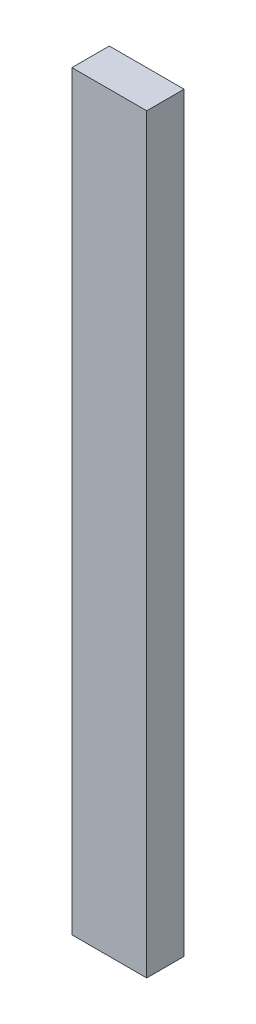
ISO-10303-21;
HEADER;
FILE_DESCRIPTION(('STEP AP214'),'2;1');
FILE_NAME('part.step','',(''),(''),'','','');
FILE_SCHEMA(('AUTOMOTIVE_DESIGN { 1 0 10303 214 1 1 1 1 }'));
ENDSEC;
DATA;
#1=APPLICATION_CONTEXT('core data for automotive mechanical design processes');
#2=APPLICATION_PROTOCOL_DEFINITION('international standard','automotive_design',2000,#1);
#3=PRODUCT_CONTEXT('',#1,'mechanical');
#4=PRODUCT('Part','Part','',(#3));
#5=PRODUCT_RELATED_PRODUCT_CATEGORY('part','',(#4));
#6=PRODUCT_DEFINITION_FORMATION('','',#4);
#7=PRODUCT_DEFINITION_CONTEXT('part definition',#1,'design');
#8=PRODUCT_DEFINITION('design','',#6,#7);
#9=PRODUCT_DEFINITION_SHAPE('','',#8);
#10=(LENGTH_UNIT() NAMED_UNIT(*) SI_UNIT(.MILLI.,.METRE.));
#11=(NAMED_UNIT(*) PLANE_ANGLE_UNIT() SI_UNIT($,.RADIAN.));
#12=(NAMED_UNIT(*) SI_UNIT($,.STERADIAN.) SOLID_ANGLE_UNIT());
#13=UNCERTAINTY_MEASURE_WITH_UNIT(LENGTH_MEASURE(1.E-05),#10,'distance_accuracy_value','');
#14=(GEOMETRIC_REPRESENTATION_CONTEXT(3) GLOBAL_UNCERTAINTY_ASSIGNED_CONTEXT((#13)) GLOBAL_UNIT_ASSIGNED_CONTEXT((#10,
#11,#12)) REPRESENTATION_CONTEXT('',''));
#15=CARTESIAN_POINT('',(0.,0.,0.));
#16=DIRECTION('',(0.,0.,1.));
#17=DIRECTION('',(1.,0.,0.));
#18=AXIS2_PLACEMENT_3D('',#15,#16,#17);
#19=CARTESIAN_POINT('',(24.,-241.,24.));
#20=DIRECTION('',(-1.,0.,0.));
#21=DIRECTION('',(0.,0.,1.));
#22=AXIS2_PLACEMENT_3D('',#19,#20,#21);
#23=PLANE('',#22);
#24=DIRECTION('',(0.,1.,0.));
#25=VECTOR('',#24,1.);
#26=CARTESIAN_POINT('',(24.,-241.,0.));
#27=LINE('',#26,#25);
#28=CARTESIAN_POINT('',(24.,-241.,0.));
#29=VERTEX_POINT('',#28);
#30=CARTESIAN_POINT('',(24.,241.,0.));
#31=VERTEX_POINT('',#30);
#32=EDGE_CURVE('E112',#29,#31,#27,.T.);
#33=ORIENTED_EDGE('',*,*,#32,.T.);
#34=DIRECTION('',(0.,0.,-1.));
#35=VECTOR('',#34,1.);
#36=CARTESIAN_POINT('',(24.,241.,24.));
#37=LINE('',#36,#35);
#38=CARTESIAN_POINT('',(24.,241.,24.));
#39=VERTEX_POINT('',#38);
#40=EDGE_CURVE('E11',#39,#31,#37,.T.);
#41=ORIENTED_EDGE('',*,*,#40,.F.);
#42=DIRECTION('',(0.,1.,0.));
#43=VECTOR('',#42,1.);
#44=CARTESIAN_POINT('',(24.,-241.,24.));
#45=LINE('',#44,#43);
#46=CARTESIAN_POINT('',(24.,-241.,24.));
#47=VERTEX_POINT('',#46);
#48=EDGE_CURVE('E95',#47,#39,#45,.T.);
#49=ORIENTED_EDGE('',*,*,#48,.F.);
#50=DIRECTION('',(0.,0.,-1.));
#51=VECTOR('',#50,1.);
#52=CARTESIAN_POINT('',(24.,-241.,24.));
#53=LINE('',#52,#51);
#54=EDGE_CURVE('E108',#47,#29,#53,.T.);
#55=ORIENTED_EDGE('',*,*,#54,.T.);
#56=EDGE_LOOP('',(#33,#41,#49,#55));
#57=FACE_BOUND('',#56,.T.);
#58=ADVANCED_FACE('F43',(#57),#23,.F.);
#59=CARTESIAN_POINT('',(-24.,241.,24.));
#60=DIRECTION('',(0.,-1.,0.));
#61=DIRECTION('',(0.,0.,-1.));
#62=AXIS2_PLACEMENT_3D('',#59,#60,#61);
#63=PLANE('',#62);
#64=DIRECTION('',(-1.,0.,0.));
#65=VECTOR('',#64,1.);
#66=CARTESIAN_POINT('',(-24.,241.,0.));
#67=LINE('',#66,#65);
#68=CARTESIAN_POINT('',(-24.,241.,0.));
#69=VERTEX_POINT('',#68);
#70=EDGE_CURVE('E100',#31,#69,#67,.T.);
#71=ORIENTED_EDGE('',*,*,#70,.T.);
#72=DIRECTION('',(0.,0.,-1.));
#73=VECTOR('',#72,1.);
#74=CARTESIAN_POINT('',(-24.,241.,24.));
#75=LINE('',#74,#73);
#76=CARTESIAN_POINT('',(-24.,241.,24.));
#77=VERTEX_POINT('',#76);
#78=EDGE_CURVE('E52',#77,#69,#75,.T.);
#79=ORIENTED_EDGE('',*,*,#78,.F.);
#80=DIRECTION('',(-1.,0.,0.));
#81=VECTOR('',#80,1.);
#82=CARTESIAN_POINT('',(-24.,241.,24.));
#83=LINE('',#82,#81);
#84=EDGE_CURVE('E90',#39,#77,#83,.T.);
#85=ORIENTED_EDGE('',*,*,#84,.F.);
#86=ORIENTED_EDGE('',*,*,#40,.T.);
#87=EDGE_LOOP('',(#71,#79,#85,#86));
#88=FACE_BOUND('',#87,.T.);
#89=ADVANCED_FACE('F99',(#88),#63,.F.);
#90=CARTESIAN_POINT('',(-24.,-241.,24.));
#91=DIRECTION('',(1.,0.,0.));
#92=DIRECTION('',(0.,0.,-1.));
#93=AXIS2_PLACEMENT_3D('',#90,#91,#92);
#94=PLANE('',#93);
#95=DIRECTION('',(0.,-1.,0.));
#96=VECTOR('',#95,1.);
#97=CARTESIAN_POINT('',(-24.,-241.,0.));
#98=LINE('',#97,#96);
#99=CARTESIAN_POINT('',(-24.,-241.,0.));
#100=VERTEX_POINT('',#99);
#101=EDGE_CURVE('E77',#69,#100,#98,.T.);
#102=ORIENTED_EDGE('',*,*,#101,.T.);
#103=DIRECTION('',(0.,0.,-1.));
#104=VECTOR('',#103,1.);
#105=CARTESIAN_POINT('',(-24.,-241.,24.));
#106=LINE('',#105,#104);
#107=CARTESIAN_POINT('',(-24.,-241.,24.));
#108=VERTEX_POINT('',#107);
#109=EDGE_CURVE('E102',#108,#100,#106,.T.);
#110=ORIENTED_EDGE('',*,*,#109,.F.);
#111=DIRECTION('',(0.,-1.,0.));
#112=VECTOR('',#111,1.);
#113=CARTESIAN_POINT('',(-24.,-241.,24.));
#114=LINE('',#113,#112);
#115=EDGE_CURVE('E93',#77,#108,#114,.T.);
#116=ORIENTED_EDGE('',*,*,#115,.F.);
#117=ORIENTED_EDGE('',*,*,#78,.T.);
#118=EDGE_LOOP('',(#102,#110,#116,#117));
#119=FACE_BOUND('',#118,.T.);
#120=ADVANCED_FACE('F103',(#119),#94,.F.);
#121=CARTESIAN_POINT('',(-24.,-241.,24.));
#122=DIRECTION('',(0.,1.,0.));
#123=DIRECTION('',(0.,0.,1.));
#124=AXIS2_PLACEMENT_3D('',#121,#122,#123);
#125=PLANE('',#124);
#126=DIRECTION('',(1.,0.,0.));
#127=VECTOR('',#126,1.);
#128=CARTESIAN_POINT('',(-24.,-241.,0.));
#129=LINE('',#128,#127);
#130=EDGE_CURVE('E83',#100,#29,#129,.T.);
#131=ORIENTED_EDGE('',*,*,#130,.T.);
#132=ORIENTED_EDGE('',*,*,#54,.F.);
#133=DIRECTION('',(1.,0.,0.));
#134=VECTOR('',#133,1.);
#135=CARTESIAN_POINT('',(-24.,-241.,24.));
#136=LINE('',#135,#134);
#137=EDGE_CURVE('E60',#108,#47,#136,.T.);
#138=ORIENTED_EDGE('',*,*,#137,.F.);
#139=ORIENTED_EDGE('',*,*,#109,.T.);
#140=EDGE_LOOP('',(#131,#132,#138,#139));
#141=FACE_BOUND('',#140,.T.);
#142=ADVANCED_FACE('F126',(#141),#125,.F.);
#143=CARTESIAN_POINT('',(0.,0.,24.));
#144=DIRECTION('',(0.,0.,-1.));
#145=DIRECTION('',(-1.,0.,0.));
#146=AXIS2_PLACEMENT_3D('',#143,#144,#145);
#147=PLANE('',#146);
#148=ORIENTED_EDGE('',*,*,#48,.T.);
#149=ORIENTED_EDGE('',*,*,#84,.T.);
#150=ORIENTED_EDGE('',*,*,#115,.T.);
#151=ORIENTED_EDGE('',*,*,#137,.T.);
#152=EDGE_LOOP('',(#148,#149,#150,#151));
#153=FACE_BOUND('',#152,.T.);
#154=ADVANCED_FACE('F91',(#153),#147,.F.);
#155=CARTESIAN_POINT('',(0.,0.,0.));
#156=DIRECTION('',(0.,0.,-1.));
#157=DIRECTION('',(-1.,0.,0.));
#158=AXIS2_PLACEMENT_3D('',#155,#156,#157);
#159=PLANE('',#158);
#160=ORIENTED_EDGE('',*,*,#32,.F.);
#161=ORIENTED_EDGE('',*,*,#130,.F.);
#162=ORIENTED_EDGE('',*,*,#101,.F.);
#163=ORIENTED_EDGE('',*,*,#70,.F.);
#164=EDGE_LOOP('',(#160,#161,#162,#163));
#165=FACE_BOUND('',#164,.T.);
#166=ADVANCED_FACE('F129',(#165),#159,.T.);
#167=CLOSED_SHELL('',(#58,#89,#120,#142,#154,#166));
#168=MANIFOLD_SOLID_BREP('B2',#167);
#169=ADVANCED_BREP_SHAPE_REPRESENTATION('',(#18,#168),#14);
#170=SHAPE_DEFINITION_REPRESENTATION(#9,#169);
ENDSEC;
END-ISO-10303-21;
